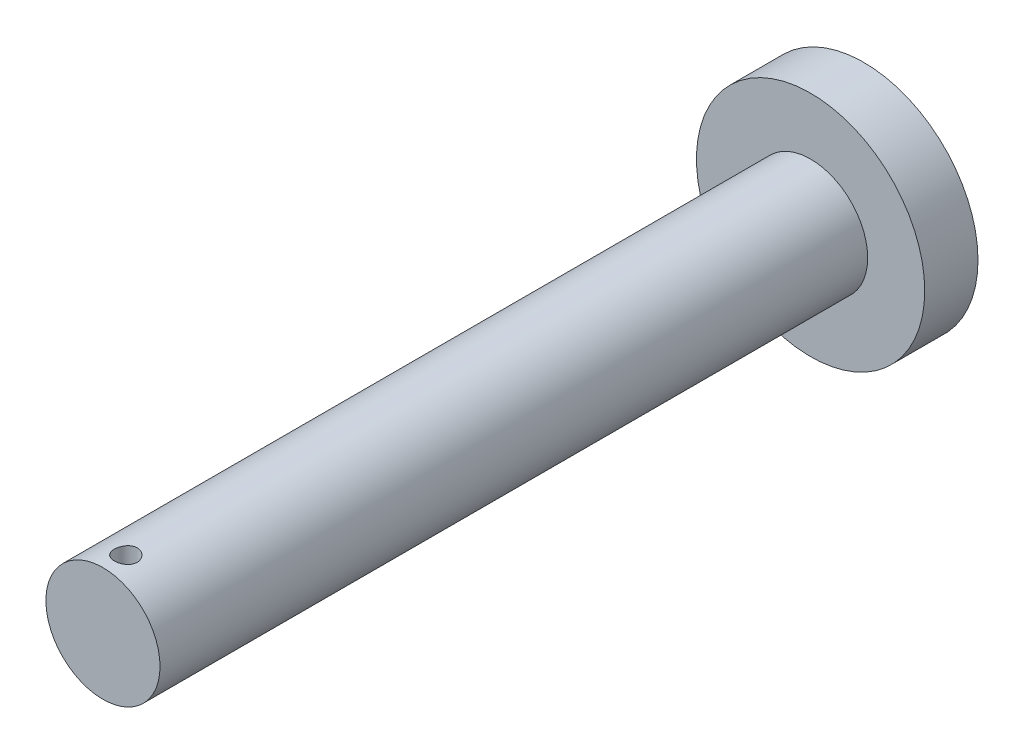
ISO-10303-21;
HEADER;
FILE_DESCRIPTION(('STEP AP214'),'2;1');
FILE_NAME('part.step','',(''),(''),'','','');
FILE_SCHEMA(('AUTOMOTIVE_DESIGN { 1 0 10303 214 1 1 1 1 }'));
ENDSEC;
DATA;
#1=APPLICATION_CONTEXT('core data for automotive mechanical design processes');
#2=APPLICATION_PROTOCOL_DEFINITION('international standard','automotive_design',2000,#1);
#3=PRODUCT_CONTEXT('',#1,'mechanical');
#4=PRODUCT('Part','Part','',(#3));
#5=PRODUCT_RELATED_PRODUCT_CATEGORY('part','',(#4));
#6=PRODUCT_DEFINITION_FORMATION('','',#4);
#7=PRODUCT_DEFINITION_CONTEXT('part definition',#1,'design');
#8=PRODUCT_DEFINITION('design','',#6,#7);
#9=PRODUCT_DEFINITION_SHAPE('','',#8);
#10=(LENGTH_UNIT() NAMED_UNIT(*) SI_UNIT(.MILLI.,.METRE.));
#11=(NAMED_UNIT(*) PLANE_ANGLE_UNIT() SI_UNIT($,.RADIAN.));
#12=(NAMED_UNIT(*) SI_UNIT($,.STERADIAN.) SOLID_ANGLE_UNIT());
#13=UNCERTAINTY_MEASURE_WITH_UNIT(LENGTH_MEASURE(1.E-05),#10,'distance_accuracy_value','');
#14=(GEOMETRIC_REPRESENTATION_CONTEXT(3) GLOBAL_UNCERTAINTY_ASSIGNED_CONTEXT((#13)) GLOBAL_UNIT_ASSIGNED_CONTEXT((#10,
#11,#12)) REPRESENTATION_CONTEXT('',''));
#15=CARTESIAN_POINT('',(0.,0.,0.));
#16=DIRECTION('',(0.,0.,1.));
#17=DIRECTION('',(1.,0.,0.));
#18=AXIS2_PLACEMENT_3D('',#15,#16,#17);
#19=CARTESIAN_POINT('',(0.,0.,14.));
#20=DIRECTION('',(0.,0.,-1.));
#21=DIRECTION('',(-1.,0.,0.));
#22=AXIS2_PLACEMENT_3D('',#19,#20,#21);
#23=CYLINDRICAL_SURFACE('',#22,30.);
#24=CARTESIAN_POINT('',(0.,0.,14.));
#25=DIRECTION('',(0.,0.,1.));
#26=DIRECTION('',(1.,0.,0.));
#27=AXIS2_PLACEMENT_3D('',#24,#25,#26);
#28=CIRCLE('',#27,30.);
#29=CARTESIAN_POINT('',(30.,0.,14.));
#30=VERTEX_POINT('',#29);
#31=EDGE_CURVE('E50',#30,#30,#28,.T.);
#32=ORIENTED_EDGE('',*,*,#31,.F.);
#33=EDGE_LOOP('',(#32));
#34=FACE_BOUND('',#33,.T.);
#35=CARTESIAN_POINT('',(0.,0.,0.));
#36=DIRECTION('',(0.,0.,1.));
#37=DIRECTION('',(1.,0.,0.));
#38=AXIS2_PLACEMENT_3D('',#35,#36,#37);
#39=CIRCLE('',#38,30.);
#40=CARTESIAN_POINT('',(30.,0.,0.));
#41=VERTEX_POINT('',#40);
#42=EDGE_CURVE('E56',#41,#41,#39,.T.);
#43=ORIENTED_EDGE('',*,*,#42,.T.);
#44=EDGE_LOOP('',(#43));
#45=FACE_BOUND('',#44,.T.);
#46=ADVANCED_FACE('F37',(#34,#45),#23,.T.);
#47=CARTESIAN_POINT('',(0.,0.,14.));
#48=DIRECTION('',(0.,0.,1.));
#49=DIRECTION('',(1.,0.,0.));
#50=AXIS2_PLACEMENT_3D('',#47,#48,#49);
#51=PLANE('',#50);
#52=CARTESIAN_POINT('',(0.,0.,14.));
#53=DIRECTION('',(0.,0.,1.));
#54=DIRECTION('',(1.,0.,0.));
#55=AXIS2_PLACEMENT_3D('',#52,#53,#54);
#56=CIRCLE('',#55,15.);
#57=CARTESIAN_POINT('',(15.,0.,14.));
#58=VERTEX_POINT('',#57);
#59=EDGE_CURVE('E10',#58,#58,#56,.T.);
#60=ORIENTED_EDGE('',*,*,#59,.F.);
#61=EDGE_LOOP('',(#60));
#62=FACE_BOUND('',#61,.T.);
#63=ORIENTED_EDGE('',*,*,#31,.T.);
#64=EDGE_LOOP('',(#63));
#65=FACE_BOUND('',#64,.T.);
#66=ADVANCED_FACE('F88',(#62,#65),#51,.T.);
#67=CARTESIAN_POINT('',(0.,0.,0.));
#68=DIRECTION('',(0.,0.,1.));
#69=DIRECTION('',(1.,0.,0.));
#70=AXIS2_PLACEMENT_3D('',#67,#68,#69);
#71=PLANE('',#70);
#72=ORIENTED_EDGE('',*,*,#42,.F.);
#73=EDGE_LOOP('',(#72));
#74=FACE_BOUND('',#73,.T.);
#75=ADVANCED_FACE('F84',(#74),#71,.F.);
#76=CARTESIAN_POINT('',(0.,0.,200.));
#77=DIRECTION('',(0.,0.,-1.));
#78=DIRECTION('',(-1.,0.,0.));
#79=AXIS2_PLACEMENT_3D('',#76,#77,#78);
#80=CYLINDRICAL_SURFACE('',#79,15.);
#81=CARTESIAN_POINT('',(0.,-15.,197.));
#82=CARTESIAN_POINT('',(0.1667307203779,-14.9999969274261,196.999993866505));
#83=CARTESIAN_POINT('',(0.333538980604567,-14.9971915553469,196.986053471097));
#84=CARTESIAN_POINT('',(0.662440523067058,-14.9862709686969,196.930704499654));
#85=CARTESIAN_POINT('',(0.824529952624068,-14.9781515358056,196.889274101595));
#86=CARTESIAN_POINT('',(1.13919091578994,-14.9575094783486,196.780276179138));
#87=CARTESIAN_POINT('',(1.2917714037994,-14.9449910723015,196.712733689466));
#88=CARTESIAN_POINT('',(1.58342396659267,-14.9169119410594,196.553503257466));
#89=CARTESIAN_POINT('',(1.72249684522743,-14.9013513970712,196.461816753178));
#90=CARTESIAN_POINT('',(1.98508043194459,-14.8686649598991,196.255584517126));
#91=CARTESIAN_POINT('',(2.10838185347557,-14.8515223651304,196.140774933826));
#92=CARTESIAN_POINT('',(2.33411026982409,-14.8177254135776,195.892122750825));
#93=CARTESIAN_POINT('',(2.43653563431128,-14.8010710950127,195.758278665995));
#94=CARTESIAN_POINT('',(2.61849526004286,-14.7699732543785,195.473851420964));
#95=CARTESIAN_POINT('',(2.6978128165976,-14.7555512209484,195.323127068611));
#96=CARTESIAN_POINT('',(2.82991699974092,-14.7307880417525,195.010154542988));
#97=CARTESIAN_POINT('',(2.88270624731171,-14.7204464928589,194.847907509961));
#98=CARTESIAN_POINT('',(2.95957589965448,-14.7051841575661,194.518746908276));
#99=CARTESIAN_POINT('',(2.98402349387633,-14.7001941032156,194.351922367573));
#100=CARTESIAN_POINT('',(3.00465638317836,-14.6959912518188,194.016470535907));
#101=CARTESIAN_POINT('',(3.0008445681405,-14.6967778640352,193.84784343104));
#102=CARTESIAN_POINT('',(2.96536371930546,-14.7039765344455,193.516259635937));
#103=CARTESIAN_POINT('',(2.93411562073172,-14.7103035857629,193.353255783118));
#104=CARTESIAN_POINT('',(2.84531365386915,-14.7277363848,193.034851770011));
#105=CARTESIAN_POINT('',(2.78775852930203,-14.7388423607334,192.879451973243));
#106=CARTESIAN_POINT('',(2.64757435102414,-14.7646685550122,192.579454214889));
#107=CARTESIAN_POINT('',(2.56477845369633,-14.7794126944111,192.434936361292));
#108=CARTESIAN_POINT('',(2.37658072371803,-14.8108385631919,192.161687450082));
#109=CARTESIAN_POINT('',(2.27117629307048,-14.827520515151,192.032958209447));
#110=CARTESIAN_POINT('',(2.03849980368175,-14.8613106372439,191.792511792629));
#111=CARTESIAN_POINT('',(1.91086848363733,-14.8784210763271,191.681142296423));
#112=CARTESIAN_POINT('',(1.63855507218602,-14.9108654614323,191.481338461096));
#113=CARTESIAN_POINT('',(1.49387276213816,-14.9261993846692,191.392904416119));
#114=CARTESIAN_POINT('',(1.19117816063675,-14.9534007048266,191.241417472322));
#115=CARTESIAN_POINT('',(1.03314545875589,-14.9652626654482,191.178404319066));
#116=CARTESIAN_POINT('',(0.708446929345984,-14.9841422696357,191.079918577884));
#117=CARTESIAN_POINT('',(0.541782150217338,-14.9911605000159,191.044442653779));
#118=CARTESIAN_POINT('',(0.207538216881441,-14.999480156006,191.002530638617));
#119=CARTESIAN_POINT('',(0.0400209849767181,-15.0008752395741,190.995618741379));
#120=CARTESIAN_POINT('',(-0.293774802578151,-14.9980515579031,191.009749576827));
#121=CARTESIAN_POINT('',(-0.460053427331386,-14.9938331082434,191.030790738058));
#122=CARTESIAN_POINT('',(-0.785116979839631,-14.9803149602405,191.099835120632));
#123=CARTESIAN_POINT('',(-0.943955845019721,-14.9710612921262,191.147594205494));
#124=CARTESIAN_POINT('',(-1.25137088249901,-14.948506561831,191.268451947967));
#125=CARTESIAN_POINT('',(-1.39994628491262,-14.9352051964268,191.341552504031));
#126=CARTESIAN_POINT('',(-1.68462352105866,-14.9057973459988,191.512047471954));
#127=CARTESIAN_POINT('',(-1.82055038025657,-14.8896585131116,191.609728343117));
#128=CARTESIAN_POINT('',(-2.07425405735763,-14.8564420448965,191.826227573622));
#129=CARTESIAN_POINT('',(-2.19202892679229,-14.8393643090516,191.9450481992));
#130=CARTESIAN_POINT('',(-2.40792177232253,-14.8058791067089,192.202620055673));
#131=CARTESIAN_POINT('',(-2.50571310734596,-14.7894858069991,192.341647232664));
#132=CARTESIAN_POINT('',(-2.67655626015361,-14.7595257538858,192.63443408407));
#133=CARTESIAN_POINT('',(-2.74960906776871,-14.7459588874003,192.788193168721));
#134=CARTESIAN_POINT('',(-2.86845552474588,-14.7233022175315,193.105304738449));
#135=CARTESIAN_POINT('',(-2.91439049937315,-14.7141892461656,193.268602523631));
#136=CARTESIAN_POINT('',(-2.97812595488159,-14.7014231037608,193.600800360473));
#137=CARTESIAN_POINT('',(-2.99593010467534,-14.6977692207333,193.769699678628));
#138=CARTESIAN_POINT('',(-3.00276273260241,-14.6963744889414,194.105026593633));
#139=CARTESIAN_POINT('',(-2.99230736421269,-14.698527575679,194.271443446781));
#140=CARTESIAN_POINT('',(-2.94405691230018,-14.7082672045384,194.600094949715));
#141=CARTESIAN_POINT('',(-2.90626204838789,-14.7158537030151,194.762329633084));
#142=CARTESIAN_POINT('',(-2.80463570549687,-14.7355579265748,195.077683133722));
#143=CARTESIAN_POINT('',(-2.74086752015204,-14.7476646305649,195.230823081507));
#144=CARTESIAN_POINT('',(-2.58916393380482,-14.7750514492251,195.524311162203));
#145=CARTESIAN_POINT('',(-2.50122650632465,-14.7903318299668,195.664658221175));
#146=CARTESIAN_POINT('',(-2.30191774435925,-14.8226688156968,195.931146716451));
#147=CARTESIAN_POINT('',(-2.19017366170554,-14.839751187291,196.057006295803));
#148=CARTESIAN_POINT('',(-1.94719310703943,-14.8735824561586,196.288358616588));
#149=CARTESIAN_POINT('',(-1.81595216146001,-14.8903312758955,196.393846670952));
#150=CARTESIAN_POINT('',(-1.53605288726475,-14.9218149716391,196.582503931839));
#151=CARTESIAN_POINT('',(-1.38722665328951,-14.9365269365774,196.66542800984));
#152=CARTESIAN_POINT('',(-1.0774990828222,-14.96205375255,196.80495836779));
#153=CARTESIAN_POINT('',(-0.916608782589377,-14.9728721141585,196.861588368597));
#154=CARTESIAN_POINT('',(-0.629464466771331,-14.9872911778611,196.935955844134));
#155=CARTESIAN_POINT('',(-0.504844992041347,-14.9920290947536,196.959929581123));
#156=CARTESIAN_POINT('',(-0.253498575630196,-14.9983846241968,196.991953737075));
#157=CARTESIAN_POINT('',(-0.126771701245854,-15.0000023361946,197.000004663529));
#158=CARTESIAN_POINT('',(0.,-15.,197.));
#159=B_SPLINE_CURVE_WITH_KNOTS('',3,(#81,#82,#83,#84,#85,#86,#87,#88,#89,#90,#91,#92,#93,#94,
#95,#96,#97,#98,#99,#100,#101,#102,#103,#104,#105,#106,#107,#108,#109,#110,#111,#112,#113,#114,
#115,#116,#117,#118,#119,#120,#121,#122,#123,#124,#125,#126,#127,#128,#129,#130,#131,#132,#133,
#134,#135,#136,#137,#138,#139,#140,#141,#142,#143,#144,#145,#146,#147,#148,#149,#150,#151,#152,
#153,#154,#155,#156,#157,#158),.UNSPECIFIED.,.T.,.F.,(4,2,2,2,2,2,2,2,2,2,2,2,2,2,2,2,2,2,2,2,2,
2,2,2,2,2,2,2,2,2,2,2,2,2,2,2,2,2,4),(0.,0.499728391983777,0.999853952073968,1.49950120575101,
1.99911870669258,2.50479801033655,3.01051679024211,3.52083585017768,4.0311044809559,
4.53468555310763,5.03821512843676,5.53415181018836,6.03011217761191,6.52942470610779,
7.02879464249012,7.53714757474053,8.04550702619461,8.55465824562073,9.06374777094109,
9.56432207028797,10.064868229736,10.5609136185217,11.0569961764807,11.5591519810008,
12.0613616503779,12.5712188573768,13.081055661704,13.5882114309817,14.0953010499124,
14.5931916770311,15.0910783047782,15.5877588375933,16.084481027456,16.5896422871743,
17.0949196359879,17.6054849002691,18.1155886655256,18.4955632586968,18.8755257411299),.UNSPECIFIED.);
#160=CARTESIAN_POINT('',(0.,-15.,197.));
#161=VERTEX_POINT('',#160);
#162=EDGE_CURVE('E40',#161,#161,#159,.T.);
#163=ORIENTED_EDGE('',*,*,#162,.T.);
#164=EDGE_LOOP('',(#163));
#165=FACE_BOUND('',#164,.T.);
#166=CARTESIAN_POINT('',(0.,15.,197.));
#167=CARTESIAN_POINT('',(-0.1667307203779,14.9999969274261,196.999993866505));
#168=CARTESIAN_POINT('',(-0.333538980604567,14.9971915553469,196.986053471097));
#169=CARTESIAN_POINT('',(-0.662440523067059,14.9862709686969,196.930704499654));
#170=CARTESIAN_POINT('',(-0.824529952624069,14.9781515358056,196.889274101595));
#171=CARTESIAN_POINT('',(-1.13919091578994,14.9575094783486,196.780276179138));
#172=CARTESIAN_POINT('',(-1.2917714037994,14.9449910723015,196.712733689466));
#173=CARTESIAN_POINT('',(-1.58342396659267,14.9169119410594,196.553503257466));
#174=CARTESIAN_POINT('',(-1.72249684522743,14.9013513970712,196.461816753178));
#175=CARTESIAN_POINT('',(-1.98508043194459,14.8686649598991,196.255584517126));
#176=CARTESIAN_POINT('',(-2.10838185347557,14.8515223651304,196.140774933826));
#177=CARTESIAN_POINT('',(-2.33411026982409,14.8177254135776,195.892122750825));
#178=CARTESIAN_POINT('',(-2.43653563431128,14.8010710950127,195.758278665995));
#179=CARTESIAN_POINT('',(-2.61849526004287,14.7699732543785,195.473851420964));
#180=CARTESIAN_POINT('',(-2.6978128165976,14.7555512209484,195.323127068611));
#181=CARTESIAN_POINT('',(-2.82991699974093,14.7307880417525,195.010154542988));
#182=CARTESIAN_POINT('',(-2.88270624731172,14.7204464928589,194.847907509961));
#183=CARTESIAN_POINT('',(-2.95957589965448,14.7051841575661,194.518746908276));
#184=CARTESIAN_POINT('',(-2.98402349387633,14.7001941032156,194.351922367573));
#185=CARTESIAN_POINT('',(-3.00465638317836,14.6959912518188,194.016470535907));
#186=CARTESIAN_POINT('',(-3.0008445681405,14.6967778640352,193.84784343104));
#187=CARTESIAN_POINT('',(-2.96536371930546,14.7039765344455,193.516259635937));
#188=CARTESIAN_POINT('',(-2.93411562073172,14.7103035857629,193.353255783118));
#189=CARTESIAN_POINT('',(-2.84531365386915,14.7277363848,193.034851770011));
#190=CARTESIAN_POINT('',(-2.78775852930203,14.7388423607334,192.879451973243));
#191=CARTESIAN_POINT('',(-2.64757435102414,14.7646685550122,192.579454214889));
#192=CARTESIAN_POINT('',(-2.56477845369633,14.7794126944111,192.434936361292));
#193=CARTESIAN_POINT('',(-2.37658072371803,14.8108385631919,192.161687450082));
#194=CARTESIAN_POINT('',(-2.27117629307048,14.827520515151,192.032958209447));
#195=CARTESIAN_POINT('',(-2.03849980368175,14.8613106372439,191.792511792629));
#196=CARTESIAN_POINT('',(-1.91086848363733,14.8784210763271,191.681142296423));
#197=CARTESIAN_POINT('',(-1.63855507218603,14.9108654614323,191.481338461096));
#198=CARTESIAN_POINT('',(-1.49387276213817,14.9261993846692,191.392904416119));
#199=CARTESIAN_POINT('',(-1.19117816063676,14.9534007048266,191.241417472322));
#200=CARTESIAN_POINT('',(-1.0331454587559,14.9652626654482,191.178404319066));
#201=CARTESIAN_POINT('',(-0.708446929345991,14.9841422696357,191.079918577884));
#202=CARTESIAN_POINT('',(-0.541782150217343,14.9911605000159,191.044442653779));
#203=CARTESIAN_POINT('',(-0.207538216881444,14.999480156006,191.002530638617));
#204=CARTESIAN_POINT('',(-0.0400209849767217,15.0008752395741,190.995618741379));
#205=CARTESIAN_POINT('',(0.293774802578147,14.9980515579031,191.009749576827));
#206=CARTESIAN_POINT('',(0.460053427331383,14.9938331082434,191.030790738058));
#207=CARTESIAN_POINT('',(0.785116979839626,14.9803149602405,191.099835120632));
#208=CARTESIAN_POINT('',(0.943955845019713,14.9710612921262,191.147594205494));
#209=CARTESIAN_POINT('',(1.25137088249901,14.948506561831,191.268451947967));
#210=CARTESIAN_POINT('',(1.39994628491262,14.9352051964268,191.341552504031));
#211=CARTESIAN_POINT('',(1.68462352105866,14.9057973459988,191.512047471954));
#212=CARTESIAN_POINT('',(1.82055038025657,14.8896585131116,191.609728343117));
#213=CARTESIAN_POINT('',(2.07425405735763,14.8564420448965,191.826227573622));
#214=CARTESIAN_POINT('',(2.19202892679229,14.8393643090516,191.9450481992));
#215=CARTESIAN_POINT('',(2.40792177232254,14.8058791067089,192.202620055673));
#216=CARTESIAN_POINT('',(2.50571310734597,14.7894858069991,192.341647232664));
#217=CARTESIAN_POINT('',(2.67655626015362,14.7595257538858,192.63443408407));
#218=CARTESIAN_POINT('',(2.74960906776872,14.7459588874003,192.788193168721));
#219=CARTESIAN_POINT('',(2.86845552474589,14.7233022175315,193.105304738449));
#220=CARTESIAN_POINT('',(2.91439049937316,14.7141892461656,193.268602523631));
#221=CARTESIAN_POINT('',(2.97812595488159,14.7014231037608,193.600800360473));
#222=CARTESIAN_POINT('',(2.99593010467534,14.6977692207333,193.769699678628));
#223=CARTESIAN_POINT('',(3.00276273260241,14.6963744889414,194.105026593633));
#224=CARTESIAN_POINT('',(2.99230736421269,14.698527575679,194.271443446781));
#225=CARTESIAN_POINT('',(2.94405691230018,14.7082672045384,194.600094949715));
#226=CARTESIAN_POINT('',(2.90626204838789,14.7158537030151,194.762329633084));
#227=CARTESIAN_POINT('',(2.80463570549686,14.7355579265748,195.077683133722));
#228=CARTESIAN_POINT('',(2.74086752015203,14.7476646305649,195.230823081507));
#229=CARTESIAN_POINT('',(2.58916393380481,14.7750514492251,195.524311162203));
#230=CARTESIAN_POINT('',(2.50122650632465,14.7903318299668,195.664658221175));
#231=CARTESIAN_POINT('',(2.30191774435925,14.8226688156968,195.931146716451));
#232=CARTESIAN_POINT('',(2.19017366170555,14.839751187291,196.057006295803));
#233=CARTESIAN_POINT('',(1.94719310703943,14.8735824561586,196.288358616587));
#234=CARTESIAN_POINT('',(1.81595216146002,14.8903312758955,196.393846670952));
#235=CARTESIAN_POINT('',(1.53605288726475,14.9218149716391,196.582503931839));
#236=CARTESIAN_POINT('',(1.38722665328951,14.9365269365774,196.66542800984));
#237=CARTESIAN_POINT('',(1.0774990828222,14.96205375255,196.80495836779));
#238=CARTESIAN_POINT('',(0.916608782589379,14.9728721141585,196.861588368597));
#239=CARTESIAN_POINT('',(0.629464466771333,14.9872911778611,196.935955844134));
#240=CARTESIAN_POINT('',(0.504844992041349,14.9920290947535,196.959929581123));
#241=CARTESIAN_POINT('',(0.253498575630197,14.9983846241968,196.991953737075));
#242=CARTESIAN_POINT('',(0.126771701245855,15.0000023361947,197.000004663529));
#243=CARTESIAN_POINT('',(0.,15.,197.));
#244=B_SPLINE_CURVE_WITH_KNOTS('',3,(#166,#167,#168,#169,#170,#171,#172,#173,#174,#175,#176,
#177,#178,#179,#180,#181,#182,#183,#184,#185,#186,#187,#188,#189,#190,#191,#192,#193,#194,#195,
#196,#197,#198,#199,#200,#201,#202,#203,#204,#205,#206,#207,#208,#209,#210,#211,#212,#213,#214,
#215,#216,#217,#218,#219,#220,#221,#222,#223,#224,#225,#226,#227,#228,#229,#230,#231,#232,#233,
#234,#235,#236,#237,#238,#239,#240,#241,#242,#243),.UNSPECIFIED.,.T.,.F.,(4,2,2,2,2,2,2,2,2,2,2,
2,2,2,2,2,2,2,2,2,2,2,2,2,2,2,2,2,2,2,2,2,2,2,2,2,2,2,4),(0.,0.499728391983778,0.99985395207397,
1.49950120575101,1.99911870669258,2.50479801033655,3.01051679024211,3.52083585017768,
4.03110448095593,4.53468555310763,5.03821512843677,5.53415181018836,6.03011217761191,
6.52942470610779,7.02879464249012,7.53714757474053,8.04550702619461,8.55465824562073,
9.06374777094108,9.56432207028796,10.064868229736,10.5609136185217,11.0569961764807,
11.5591519810008,12.0613616503779,12.5712188573768,13.081055661704,13.5882114309817,
14.0953010499125,14.5931916770311,15.0910783047782,15.5877588375933,16.084481027456,
16.5896422871743,17.0949196359879,17.6054849002691,18.1155886655256,18.4955632586968,
18.8755257411299),.UNSPECIFIED.);
#245=CARTESIAN_POINT('',(0.,15.,197.));
#246=VERTEX_POINT('',#245);
#247=EDGE_CURVE('E63',#246,#246,#244,.T.);
#248=ORIENTED_EDGE('',*,*,#247,.T.);
#249=EDGE_LOOP('',(#248));
#250=FACE_BOUND('',#249,.T.);
#251=CARTESIAN_POINT('',(0.,0.,200.));
#252=DIRECTION('',(0.,0.,1.));
#253=DIRECTION('',(1.,0.,0.));
#254=AXIS2_PLACEMENT_3D('',#251,#252,#253);
#255=CIRCLE('',#254,15.);
#256=CARTESIAN_POINT('',(15.,0.,200.));
#257=VERTEX_POINT('',#256);
#258=EDGE_CURVE('E59',#257,#257,#255,.T.);
#259=ORIENTED_EDGE('',*,*,#258,.F.);
#260=EDGE_LOOP('',(#259));
#261=FACE_BOUND('',#260,.T.);
#262=ORIENTED_EDGE('',*,*,#59,.T.);
#263=EDGE_LOOP('',(#262));
#264=FACE_BOUND('',#263,.T.);
#265=ADVANCED_FACE('F69',(#165,#250,#261,#264),#80,.T.);
#266=CARTESIAN_POINT('',(0.,0.,200.));
#267=DIRECTION('',(0.,0.,1.));
#268=DIRECTION('',(1.,0.,0.));
#269=AXIS2_PLACEMENT_3D('',#266,#267,#268);
#270=PLANE('',#269);
#271=ORIENTED_EDGE('',*,*,#258,.T.);
#272=EDGE_LOOP('',(#271));
#273=FACE_BOUND('',#272,.T.);
#274=ADVANCED_FACE('F76',(#273),#270,.T.);
#275=CARTESIAN_POINT('',(0.,-93.,194.));
#276=DIRECTION('',(0.,1.,0.));
#277=DIRECTION('',(0.,0.,1.));
#278=AXIS2_PLACEMENT_3D('',#275,#276,#277);
#279=CYLINDRICAL_SURFACE('',#278,3.);
#280=ORIENTED_EDGE('',*,*,#247,.F.);
#281=EDGE_LOOP('',(#280));
#282=FACE_BOUND('',#281,.T.);
#283=ORIENTED_EDGE('',*,*,#162,.F.);
#284=EDGE_LOOP('',(#283));
#285=FACE_BOUND('',#284,.T.);
#286=ADVANCED_FACE('F73',(#282,#285),#279,.F.);
#287=CLOSED_SHELL('',(#46,#66,#75,#265,#274,#286));
#288=MANIFOLD_SOLID_BREP('B2',#287);
#289=ADVANCED_BREP_SHAPE_REPRESENTATION('',(#18,#288),#14);
#290=SHAPE_DEFINITION_REPRESENTATION(#9,#289);
ENDSEC;
END-ISO-10303-21;
